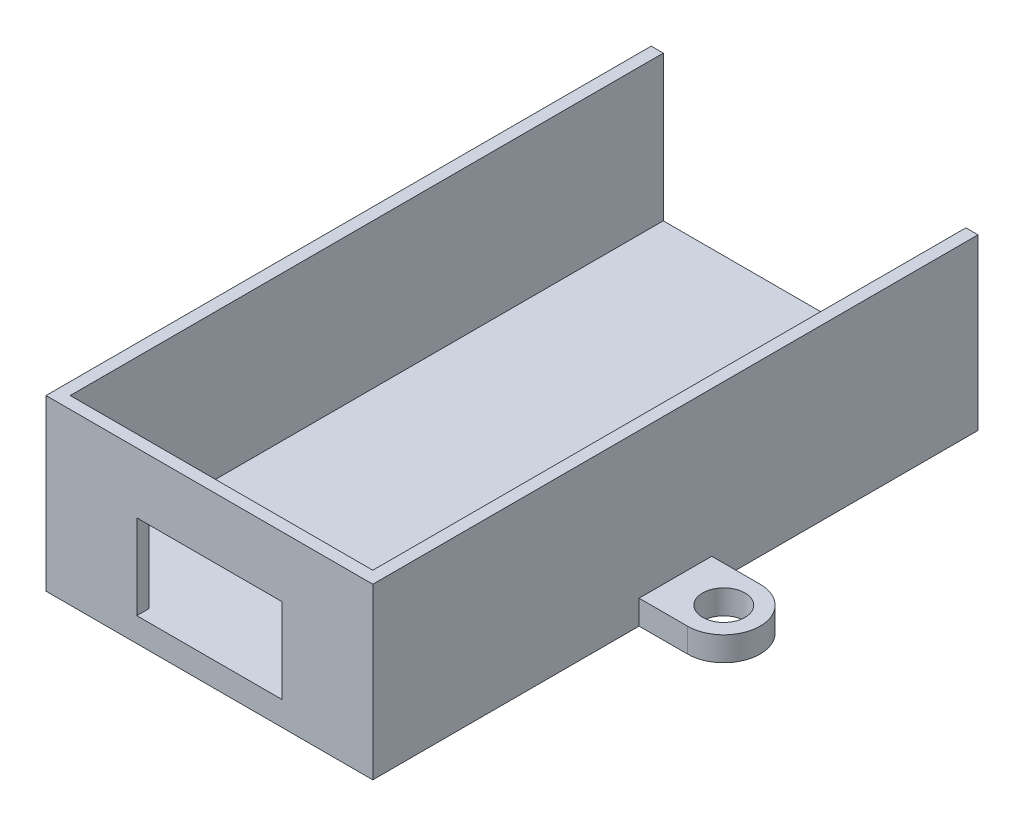
ISO-10303-21;
HEADER;
FILE_DESCRIPTION(('STEP AP214'),'2;1');
FILE_NAME('part.step','',(''),(''),'','','');
FILE_SCHEMA(('AUTOMOTIVE_DESIGN { 1 0 10303 214 1 1 1 1 }'));
ENDSEC;
DATA;
#1=APPLICATION_CONTEXT('core data for automotive mechanical design processes');
#2=APPLICATION_PROTOCOL_DEFINITION('international standard','automotive_design',2000,#1);
#3=PRODUCT_CONTEXT('',#1,'mechanical');
#4=PRODUCT('Part','Part','',(#3));
#5=PRODUCT_RELATED_PRODUCT_CATEGORY('part','',(#4));
#6=PRODUCT_DEFINITION_FORMATION('','',#4);
#7=PRODUCT_DEFINITION_CONTEXT('part definition',#1,'design');
#8=PRODUCT_DEFINITION('design','',#6,#7);
#9=PRODUCT_DEFINITION_SHAPE('','',#8);
#10=(LENGTH_UNIT() NAMED_UNIT(*) SI_UNIT(.MILLI.,.METRE.));
#11=(NAMED_UNIT(*) PLANE_ANGLE_UNIT() SI_UNIT($,.RADIAN.));
#12=(NAMED_UNIT(*) SI_UNIT($,.STERADIAN.) SOLID_ANGLE_UNIT());
#13=UNCERTAINTY_MEASURE_WITH_UNIT(LENGTH_MEASURE(1.E-05),#10,'distance_accuracy_value','');
#14=(GEOMETRIC_REPRESENTATION_CONTEXT(3) GLOBAL_UNCERTAINTY_ASSIGNED_CONTEXT((#13)) GLOBAL_UNIT_ASSIGNED_CONTEXT((#10,
#11,#12)) REPRESENTATION_CONTEXT('',''));
#15=CARTESIAN_POINT('',(0.,0.,0.));
#16=DIRECTION('',(0.,0.,1.));
#17=DIRECTION('',(1.,0.,0.));
#18=AXIS2_PLACEMENT_3D('',#15,#16,#17);
#19=CARTESIAN_POINT('',(0.,2.,0.));
#20=DIRECTION('',(0.,1.,0.));
#21=DIRECTION('',(0.,0.,1.));
#22=AXIS2_PLACEMENT_3D('',#19,#20,#21);
#23=PLANE('',#22);
#24=DIRECTION('',(0.,0.,-1.));
#25=VECTOR('',#24,1.);
#26=CARTESIAN_POINT('',(13.5,2.,25.));
#27=LINE('',#26,#25);
#28=CARTESIAN_POINT('',(13.5,2.,3.));
#29=VERTEX_POINT('',#28);
#30=CARTESIAN_POINT('',(13.5,2.,-3.));
#31=VERTEX_POINT('',#30);
#32=EDGE_CURVE('E249',#29,#31,#27,.T.);
#33=ORIENTED_EDGE('',*,*,#32,.F.);
#34=DIRECTION('',(-1.,0.,0.));
#35=VECTOR('',#34,1.);
#36=CARTESIAN_POINT('',(0.,2.,3.));
#37=LINE('',#36,#35);
#38=CARTESIAN_POINT('',(17.5,2.,3.));
#39=VERTEX_POINT('',#38);
#40=EDGE_CURVE('E283',#39,#29,#37,.T.);
#41=ORIENTED_EDGE('',*,*,#40,.F.);
#42=CARTESIAN_POINT('',(17.5,2.,0.));
#43=DIRECTION('',(0.,1.,0.));
#44=DIRECTION('',(0.,0.,1.));
#45=AXIS2_PLACEMENT_3D('',#42,#43,#44);
#46=CIRCLE('',#45,3.);
#47=CARTESIAN_POINT('',(17.5,2.,-3.));
#48=VERTEX_POINT('',#47);
#49=EDGE_CURVE('E286',#39,#48,#46,.T.);
#50=ORIENTED_EDGE('',*,*,#49,.T.);
#51=DIRECTION('',(-1.,0.,0.));
#52=VECTOR('',#51,1.);
#53=CARTESIAN_POINT('',(0.,2.,-3.));
#54=LINE('',#53,#52);
#55=EDGE_CURVE('E291',#48,#31,#54,.T.);
#56=ORIENTED_EDGE('',*,*,#55,.T.);
#57=EDGE_LOOP('',(#33,#41,#50,#56));
#58=FACE_BOUND('',#57,.T.);
#59=CARTESIAN_POINT('',(17.5,2.,0.));
#60=DIRECTION('',(0.,1.,0.));
#61=DIRECTION('',(0.,0.,1.));
#62=AXIS2_PLACEMENT_3D('',#59,#60,#61);
#63=CIRCLE('',#62,1.75);
#64=CARTESIAN_POINT('',(17.5,2.,1.75));
#65=VERTEX_POINT('',#64);
#66=EDGE_CURVE('E309',#65,#65,#63,.T.);
#67=ORIENTED_EDGE('',*,*,#66,.F.);
#68=EDGE_LOOP('',(#67));
#69=FACE_BOUND('',#68,.T.);
#70=ADVANCED_FACE('F50',(#58,#69),#23,.T.);
#71=DIRECTION('',(0.,0.,1.));
#72=VECTOR('',#71,1.);
#73=CARTESIAN_POINT('',(-13.5,2.,-25.));
#74=LINE('',#73,#72);
#75=CARTESIAN_POINT('',(-13.5,2.,-3.));
#76=VERTEX_POINT('',#75);
#77=CARTESIAN_POINT('',(-13.5,2.,3.));
#78=VERTEX_POINT('',#77);
#79=EDGE_CURVE('E251',#76,#78,#74,.T.);
#80=ORIENTED_EDGE('',*,*,#79,.F.);
#81=DIRECTION('',(1.,0.,0.));
#82=VECTOR('',#81,1.);
#83=CARTESIAN_POINT('',(0.,2.,-3.));
#84=LINE('',#83,#82);
#85=CARTESIAN_POINT('',(-17.5,2.,-3.));
#86=VERTEX_POINT('',#85);
#87=EDGE_CURVE('E296',#86,#76,#84,.T.);
#88=ORIENTED_EDGE('',*,*,#87,.F.);
#89=CARTESIAN_POINT('',(-17.5,2.,0.));
#90=DIRECTION('',(0.,1.,0.));
#91=DIRECTION('',(0.,0.,1.));
#92=AXIS2_PLACEMENT_3D('',#89,#90,#91);
#93=CIRCLE('',#92,3.);
#94=CARTESIAN_POINT('',(-17.5,2.,3.));
#95=VERTEX_POINT('',#94);
#96=EDGE_CURVE('E304',#95,#86,#93,.F.);
#97=ORIENTED_EDGE('',*,*,#96,.F.);
#98=DIRECTION('',(1.,0.,0.));
#99=VECTOR('',#98,1.);
#100=CARTESIAN_POINT('',(0.,2.,3.));
#101=LINE('',#100,#99);
#102=EDGE_CURVE('E307',#95,#78,#101,.T.);
#103=ORIENTED_EDGE('',*,*,#102,.T.);
#104=EDGE_LOOP('',(#80,#88,#97,#103));
#105=FACE_BOUND('',#104,.T.);
#106=CARTESIAN_POINT('',(-17.5,2.,0.));
#107=DIRECTION('',(0.,1.,0.));
#108=DIRECTION('',(0.,0.,1.));
#109=AXIS2_PLACEMENT_3D('',#106,#107,#108);
#110=CIRCLE('',#109,1.75);
#111=CARTESIAN_POINT('',(-17.5,2.,1.75));
#112=VERTEX_POINT('',#111);
#113=EDGE_CURVE('E314',#112,#112,#110,.F.);
#114=ORIENTED_EDGE('',*,*,#113,.T.);
#115=EDGE_LOOP('',(#114));
#116=FACE_BOUND('',#115,.T.);
#117=ADVANCED_FACE('F479',(#105,#116),#23,.T.);
#118=CARTESIAN_POINT('',(0.,2.,25.));
#119=DIRECTION('',(0.,0.,-1.));
#120=DIRECTION('',(-1.,0.,0.));
#121=AXIS2_PLACEMENT_3D('',#118,#119,#120);
#122=PLANE('',#121);
#123=DIRECTION('',(-1.,0.,0.));
#124=VECTOR('',#123,1.);
#125=CARTESIAN_POINT('',(-6.,9.,25.));
#126=LINE('',#125,#124);
#127=CARTESIAN_POINT('',(6.,9.,25.));
#128=VERTEX_POINT('',#127);
#129=CARTESIAN_POINT('',(-6.,9.,25.));
#130=VERTEX_POINT('',#129);
#131=EDGE_CURVE('E198',#128,#130,#126,.T.);
#132=ORIENTED_EDGE('',*,*,#131,.F.);
#133=DIRECTION('',(0.,1.,0.));
#134=VECTOR('',#133,1.);
#135=CARTESIAN_POINT('',(6.,9.,25.));
#136=LINE('',#135,#134);
#137=CARTESIAN_POINT('',(6.,2.,25.));
#138=VERTEX_POINT('',#137);
#139=EDGE_CURVE('E64',#138,#128,#136,.T.);
#140=ORIENTED_EDGE('',*,*,#139,.F.);
#141=DIRECTION('',(1.,0.,0.));
#142=VECTOR('',#141,1.);
#143=CARTESIAN_POINT('',(6.,2.,25.));
#144=LINE('',#143,#142);
#145=CARTESIAN_POINT('',(-5.99999999999999,2.,25.));
#146=VERTEX_POINT('',#145);
#147=EDGE_CURVE('E201',#146,#138,#144,.T.);
#148=ORIENTED_EDGE('',*,*,#147,.F.);
#149=DIRECTION('',(0.,-1.,0.));
#150=VECTOR('',#149,1.);
#151=CARTESIAN_POINT('',(-6.,9.,25.));
#152=LINE('',#151,#150);
#153=EDGE_CURVE('E190',#130,#146,#152,.T.);
#154=ORIENTED_EDGE('',*,*,#153,.F.);
#155=EDGE_LOOP('',(#132,#140,#148,#154));
#156=FACE_BOUND('',#155,.T.);
#157=DIRECTION('',(1.,0.,0.));
#158=VECTOR('',#157,1.);
#159=CARTESIAN_POINT('',(0.,0.,25.));
#160=LINE('',#159,#158);
#161=CARTESIAN_POINT('',(-13.5,0.,25.));
#162=VERTEX_POINT('',#161);
#163=CARTESIAN_POINT('',(13.5,0.,25.));
#164=VERTEX_POINT('',#163);
#165=EDGE_CURVE('E325',#162,#164,#160,.T.);
#166=ORIENTED_EDGE('',*,*,#165,.T.);
#167=DIRECTION('',(0.,-1.,0.));
#168=VECTOR('',#167,1.);
#169=CARTESIAN_POINT('',(13.5,2.,25.));
#170=LINE('',#169,#168);
#171=CARTESIAN_POINT('',(13.5,14.,25.));
#172=VERTEX_POINT('',#171);
#173=EDGE_CURVE('E393',#172,#164,#170,.T.);
#174=ORIENTED_EDGE('',*,*,#173,.F.);
#175=DIRECTION('',(1.,0.,0.));
#176=VECTOR('',#175,1.);
#177=CARTESIAN_POINT('',(-13.5,14.,25.));
#178=LINE('',#177,#176);
#179=CARTESIAN_POINT('',(-13.5,14.,25.));
#180=VERTEX_POINT('',#179);
#181=EDGE_CURVE('E244',#180,#172,#178,.T.);
#182=ORIENTED_EDGE('',*,*,#181,.F.);
#183=DIRECTION('',(0.,-1.,0.));
#184=VECTOR('',#183,1.);
#185=CARTESIAN_POINT('',(-13.5,2.,25.));
#186=LINE('',#185,#184);
#187=EDGE_CURVE('E268',#180,#162,#186,.T.);
#188=ORIENTED_EDGE('',*,*,#187,.T.);
#189=EDGE_LOOP('',(#166,#174,#182,#188));
#190=FACE_BOUND('',#189,.T.);
#191=ADVANCED_FACE('F47',(#156,#190),#122,.F.);
#192=CARTESIAN_POINT('',(0.,2.,3.));
#193=DIRECTION('',(0.,0.,1.));
#194=DIRECTION('',(1.,0.,0.));
#195=AXIS2_PLACEMENT_3D('',#192,#193,#194);
#196=PLANE('',#195);
#197=DIRECTION('',(-1.,0.,0.));
#198=VECTOR('',#197,1.);
#199=CARTESIAN_POINT('',(0.,0.,3.));
#200=LINE('',#199,#198);
#201=CARTESIAN_POINT('',(17.5,0.,3.));
#202=VERTEX_POINT('',#201);
#203=CARTESIAN_POINT('',(13.5,0.,3.));
#204=VERTEX_POINT('',#203);
#205=EDGE_CURVE('E329',#202,#204,#200,.T.);
#206=ORIENTED_EDGE('',*,*,#205,.F.);
#207=DIRECTION('',(0.,-1.,0.));
#208=VECTOR('',#207,1.);
#209=CARTESIAN_POINT('',(17.5,2.,3.));
#210=LINE('',#209,#208);
#211=EDGE_CURVE('E386',#39,#202,#210,.T.);
#212=ORIENTED_EDGE('',*,*,#211,.F.);
#213=ORIENTED_EDGE('',*,*,#40,.T.);
#214=DIRECTION('',(0.,-1.,0.));
#215=VECTOR('',#214,1.);
#216=CARTESIAN_POINT('',(13.5,2.,3.));
#217=LINE('',#216,#215);
#218=EDGE_CURVE('E395',#29,#204,#217,.T.);
#219=ORIENTED_EDGE('',*,*,#218,.T.);
#220=EDGE_LOOP('',(#206,#212,#213,#219));
#221=FACE_BOUND('',#220,.T.);
#222=ADVANCED_FACE('F450',(#221),#196,.T.);
#223=CARTESIAN_POINT('',(17.5,2.,0.));
#224=DIRECTION('',(0.,-1.,0.));
#225=DIRECTION('',(0.,0.,-1.));
#226=AXIS2_PLACEMENT_3D('',#223,#224,#225);
#227=CYLINDRICAL_SURFACE('',#226,3.);
#228=CARTESIAN_POINT('',(17.5,0.,0.));
#229=DIRECTION('',(0.,1.,0.));
#230=DIRECTION('',(0.,0.,1.));
#231=AXIS2_PLACEMENT_3D('',#228,#229,#230);
#232=CIRCLE('',#231,3.);
#233=CARTESIAN_POINT('',(17.5,0.,-3.));
#234=VERTEX_POINT('',#233);
#235=EDGE_CURVE('E333',#202,#234,#232,.T.);
#236=ORIENTED_EDGE('',*,*,#235,.T.);
#237=DIRECTION('',(0.,-1.,0.));
#238=VECTOR('',#237,1.);
#239=CARTESIAN_POINT('',(17.5,2.,-3.));
#240=LINE('',#239,#238);
#241=EDGE_CURVE('E384',#48,#234,#240,.T.);
#242=ORIENTED_EDGE('',*,*,#241,.F.);
#243=ORIENTED_EDGE('',*,*,#49,.F.);
#244=ORIENTED_EDGE('',*,*,#211,.T.);
#245=EDGE_LOOP('',(#236,#242,#243,#244));
#246=FACE_BOUND('',#245,.T.);
#247=ADVANCED_FACE('F441',(#246),#227,.T.);
#248=CARTESIAN_POINT('',(0.,2.,-3.));
#249=DIRECTION('',(0.,0.,1.));
#250=DIRECTION('',(1.,0.,0.));
#251=AXIS2_PLACEMENT_3D('',#248,#249,#250);
#252=PLANE('',#251);
#253=DIRECTION('',(-1.,0.,0.));
#254=VECTOR('',#253,1.);
#255=CARTESIAN_POINT('',(0.,0.,-3.));
#256=LINE('',#255,#254);
#257=CARTESIAN_POINT('',(13.5,0.,-3.));
#258=VERTEX_POINT('',#257);
#259=EDGE_CURVE('E339',#234,#258,#256,.T.);
#260=ORIENTED_EDGE('',*,*,#259,.T.);
#261=DIRECTION('',(0.,-1.,0.));
#262=VECTOR('',#261,1.);
#263=CARTESIAN_POINT('',(13.5,2.,-3.));
#264=LINE('',#263,#262);
#265=EDGE_CURVE('E381',#31,#258,#264,.T.);
#266=ORIENTED_EDGE('',*,*,#265,.F.);
#267=ORIENTED_EDGE('',*,*,#55,.F.);
#268=ORIENTED_EDGE('',*,*,#241,.T.);
#269=EDGE_LOOP('',(#260,#266,#267,#268));
#270=FACE_BOUND('',#269,.T.);
#271=ADVANCED_FACE('F438',(#270),#252,.F.);
#272=CARTESIAN_POINT('',(13.5,2.,0.));
#273=DIRECTION('',(-1.,0.,0.));
#274=DIRECTION('',(0.,0.,1.));
#275=AXIS2_PLACEMENT_3D('',#272,#273,#274);
#276=PLANE('',#275);
#277=DIRECTION('',(0.,0.,-1.));
#278=VECTOR('',#277,1.);
#279=CARTESIAN_POINT('',(13.5,0.,0.));
#280=LINE('',#279,#278);
#281=CARTESIAN_POINT('',(13.5,0.,-25.));
#282=VERTEX_POINT('',#281);
#283=EDGE_CURVE('E332',#258,#282,#280,.T.);
#284=ORIENTED_EDGE('',*,*,#283,.T.);
#285=DIRECTION('',(0.,-1.,0.));
#286=VECTOR('',#285,1.);
#287=CARTESIAN_POINT('',(13.5,2.,-25.));
#288=LINE('',#287,#286);
#289=CARTESIAN_POINT('',(13.5,14.,-25.));
#290=VERTEX_POINT('',#289);
#291=EDGE_CURVE('E378',#290,#282,#288,.T.);
#292=ORIENTED_EDGE('',*,*,#291,.F.);
#293=DIRECTION('',(0.,0.,-1.));
#294=VECTOR('',#293,1.);
#295=CARTESIAN_POINT('',(13.5,14.,25.));
#296=LINE('',#295,#294);
#297=EDGE_CURVE('E217',#172,#290,#296,.T.);
#298=ORIENTED_EDGE('',*,*,#297,.F.);
#299=ORIENTED_EDGE('',*,*,#173,.T.);
#300=EDGE_CURVE('E326',#164,#204,#280,.T.);
#301=ORIENTED_EDGE('',*,*,#300,.T.);
#302=ORIENTED_EDGE('',*,*,#218,.F.);
#303=ORIENTED_EDGE('',*,*,#32,.T.);
#304=ORIENTED_EDGE('',*,*,#265,.T.);
#305=EDGE_LOOP('',(#284,#292,#298,#299,#301,#302,#303,#304));
#306=FACE_BOUND('',#305,.T.);
#307=ADVANCED_FACE('F433',(#306),#276,.F.);
#308=CARTESIAN_POINT('',(0.,2.,-25.));
#309=DIRECTION('',(0.,0.,-1.));
#310=DIRECTION('',(-1.,0.,0.));
#311=AXIS2_PLACEMENT_3D('',#308,#309,#310);
#312=PLANE('',#311);
#313=DIRECTION('',(1.,0.,0.));
#314=VECTOR('',#313,1.);
#315=CARTESIAN_POINT('',(0.,0.,-25.));
#316=LINE('',#315,#314);
#317=CARTESIAN_POINT('',(-13.5,0.,-25.));
#318=VERTEX_POINT('',#317);
#319=EDGE_CURVE('E342',#318,#282,#316,.T.);
#320=ORIENTED_EDGE('',*,*,#319,.F.);
#321=DIRECTION('',(0.,-1.,0.));
#322=VECTOR('',#321,1.);
#323=CARTESIAN_POINT('',(-13.5,2.,-25.));
#324=LINE('',#323,#322);
#325=CARTESIAN_POINT('',(-13.5,14.,-25.));
#326=VERTEX_POINT('',#325);
#327=EDGE_CURVE('E374',#326,#318,#324,.T.);
#328=ORIENTED_EDGE('',*,*,#327,.F.);
#329=DIRECTION('',(-1.,0.,0.));
#330=VECTOR('',#329,1.);
#331=CARTESIAN_POINT('',(-13.5,14.,-25.));
#332=LINE('',#331,#330);
#333=CARTESIAN_POINT('',(-12.5,14.,-25.));
#334=VERTEX_POINT('',#333);
#335=EDGE_CURVE('E233',#334,#326,#332,.T.);
#336=ORIENTED_EDGE('',*,*,#335,.F.);
#337=DIRECTION('',(0.,-1.,0.));
#338=VECTOR('',#337,1.);
#339=CARTESIAN_POINT('',(-12.5,14.,-25.));
#340=LINE('',#339,#338);
#341=CARTESIAN_POINT('',(-12.5,2.,-25.));
#342=VERTEX_POINT('',#341);
#343=EDGE_CURVE('E250',#334,#342,#340,.T.);
#344=ORIENTED_EDGE('',*,*,#343,.T.);
#345=DIRECTION('',(1.,0.,0.));
#346=VECTOR('',#345,1.);
#347=CARTESIAN_POINT('',(0.,2.,-25.));
#348=LINE('',#347,#346);
#349=CARTESIAN_POINT('',(12.5,2.,-25.));
#350=VERTEX_POINT('',#349);
#351=EDGE_CURVE('E297',#342,#350,#348,.T.);
#352=ORIENTED_EDGE('',*,*,#351,.T.);
#353=DIRECTION('',(0.,-1.,0.));
#354=VECTOR('',#353,1.);
#355=CARTESIAN_POINT('',(12.5,14.,-25.));
#356=LINE('',#355,#354);
#357=CARTESIAN_POINT('',(12.5,14.,-25.));
#358=VERTEX_POINT('',#357);
#359=EDGE_CURVE('E278',#358,#350,#356,.T.);
#360=ORIENTED_EDGE('',*,*,#359,.F.);
#361=DIRECTION('',(-1.,0.,0.));
#362=VECTOR('',#361,1.);
#363=CARTESIAN_POINT('',(12.5,14.,-25.));
#364=LINE('',#363,#362);
#365=EDGE_CURVE('E225',#290,#358,#364,.T.);
#366=ORIENTED_EDGE('',*,*,#365,.F.);
#367=ORIENTED_EDGE('',*,*,#291,.T.);
#368=EDGE_LOOP('',(#320,#328,#336,#344,#352,#360,#366,#367));
#369=FACE_BOUND('',#368,.T.);
#370=ADVANCED_FACE('F428',(#369),#312,.T.);
#371=CARTESIAN_POINT('',(-13.5,2.,0.));
#372=DIRECTION('',(-1.,0.,0.));
#373=DIRECTION('',(0.,0.,1.));
#374=AXIS2_PLACEMENT_3D('',#371,#372,#373);
#375=PLANE('',#374);
#376=DIRECTION('',(0.,0.,-1.));
#377=VECTOR('',#376,1.);
#378=CARTESIAN_POINT('',(-13.5,0.,0.));
#379=LINE('',#378,#377);
#380=CARTESIAN_POINT('',(-13.5,0.,-3.));
#381=VERTEX_POINT('',#380);
#382=EDGE_CURVE('E323',#381,#318,#379,.T.);
#383=ORIENTED_EDGE('',*,*,#382,.F.);
#384=DIRECTION('',(0.,-1.,0.));
#385=VECTOR('',#384,1.);
#386=CARTESIAN_POINT('',(-13.5,2.,-3.));
#387=LINE('',#386,#385);
#388=EDGE_CURVE('E375',#76,#381,#387,.T.);
#389=ORIENTED_EDGE('',*,*,#388,.F.);
#390=ORIENTED_EDGE('',*,*,#79,.T.);
#391=DIRECTION('',(0.,-1.,0.));
#392=VECTOR('',#391,1.);
#393=CARTESIAN_POINT('',(-13.5,2.,3.));
#394=LINE('',#393,#392);
#395=CARTESIAN_POINT('',(-13.5,0.,3.));
#396=VERTEX_POINT('',#395);
#397=EDGE_CURVE('E318',#78,#396,#394,.T.);
#398=ORIENTED_EDGE('',*,*,#397,.T.);
#399=EDGE_CURVE('E281',#162,#396,#379,.T.);
#400=ORIENTED_EDGE('',*,*,#399,.F.);
#401=ORIENTED_EDGE('',*,*,#187,.F.);
#402=DIRECTION('',(0.,0.,1.));
#403=VECTOR('',#402,1.);
#404=CARTESIAN_POINT('',(-13.5,14.,-25.));
#405=LINE('',#404,#403);
#406=EDGE_CURVE('E239',#326,#180,#405,.T.);
#407=ORIENTED_EDGE('',*,*,#406,.F.);
#408=ORIENTED_EDGE('',*,*,#327,.T.);
#409=EDGE_LOOP('',(#383,#389,#390,#398,#400,#401,#407,#408));
#410=FACE_BOUND('',#409,.T.);
#411=ADVANCED_FACE('F424',(#410),#375,.T.);
#412=CARTESIAN_POINT('',(0.,2.,-3.));
#413=DIRECTION('',(0.,0.,-1.));
#414=DIRECTION('',(-1.,0.,0.));
#415=AXIS2_PLACEMENT_3D('',#412,#413,#414);
#416=PLANE('',#415);
#417=DIRECTION('',(1.,0.,0.));
#418=VECTOR('',#417,1.);
#419=CARTESIAN_POINT('',(0.,0.,-3.));
#420=LINE('',#419,#418);
#421=CARTESIAN_POINT('',(-17.5,0.,-3.));
#422=VERTEX_POINT('',#421);
#423=EDGE_CURVE('E343',#422,#381,#420,.T.);
#424=ORIENTED_EDGE('',*,*,#423,.F.);
#425=DIRECTION('',(0.,-1.,0.));
#426=VECTOR('',#425,1.);
#427=CARTESIAN_POINT('',(-17.5,2.,-3.));
#428=LINE('',#427,#426);
#429=EDGE_CURVE('E369',#86,#422,#428,.T.);
#430=ORIENTED_EDGE('',*,*,#429,.F.);
#431=ORIENTED_EDGE('',*,*,#87,.T.);
#432=ORIENTED_EDGE('',*,*,#388,.T.);
#433=EDGE_LOOP('',(#424,#430,#431,#432));
#434=FACE_BOUND('',#433,.T.);
#435=ADVANCED_FACE('F514',(#434),#416,.T.);
#436=CARTESIAN_POINT('',(-17.5,2.,0.));
#437=DIRECTION('',(0.,-1.,0.));
#438=DIRECTION('',(0.,0.,-1.));
#439=AXIS2_PLACEMENT_3D('',#436,#437,#438);
#440=CYLINDRICAL_SURFACE('',#439,3.);
#441=CARTESIAN_POINT('',(-17.5,0.,0.));
#442=DIRECTION('',(0.,1.,0.));
#443=DIRECTION('',(0.,0.,1.));
#444=AXIS2_PLACEMENT_3D('',#441,#442,#443);
#445=CIRCLE('',#444,3.);
#446=CARTESIAN_POINT('',(-17.5,0.,3.));
#447=VERTEX_POINT('',#446);
#448=EDGE_CURVE('E349',#447,#422,#445,.F.);
#449=ORIENTED_EDGE('',*,*,#448,.F.);
#450=DIRECTION('',(0.,-1.,0.));
#451=VECTOR('',#450,1.);
#452=CARTESIAN_POINT('',(-17.5,2.,3.));
#453=LINE('',#452,#451);
#454=EDGE_CURVE('E368',#95,#447,#453,.T.);
#455=ORIENTED_EDGE('',*,*,#454,.F.);
#456=ORIENTED_EDGE('',*,*,#96,.T.);
#457=ORIENTED_EDGE('',*,*,#429,.T.);
#458=EDGE_LOOP('',(#449,#455,#456,#457));
#459=FACE_BOUND('',#458,.T.);
#460=ADVANCED_FACE('F506',(#459),#440,.T.);
#461=CARTESIAN_POINT('',(17.5,2.,0.));
#462=DIRECTION('',(0.,-1.,0.));
#463=DIRECTION('',(0.,0.,-1.));
#464=AXIS2_PLACEMENT_3D('',#461,#462,#463);
#465=CYLINDRICAL_SURFACE('',#464,1.75);
#466=ORIENTED_EDGE('',*,*,#66,.T.);
#467=EDGE_LOOP('',(#466));
#468=FACE_BOUND('',#467,.T.);
#469=CARTESIAN_POINT('',(17.5,0.,0.));
#470=DIRECTION('',(0.,1.,0.));
#471=DIRECTION('',(0.,0.,1.));
#472=AXIS2_PLACEMENT_3D('',#469,#470,#471);
#473=CIRCLE('',#472,1.75);
#474=CARTESIAN_POINT('',(17.5,0.,1.75));
#475=VERTEX_POINT('',#474);
#476=EDGE_CURVE('E360',#475,#475,#473,.T.);
#477=ORIENTED_EDGE('',*,*,#476,.F.);
#478=EDGE_LOOP('',(#477));
#479=FACE_BOUND('',#478,.T.);
#480=ADVANCED_FACE('F504',(#468,#479),#465,.F.);
#481=CARTESIAN_POINT('',(0.,2.,3.));
#482=DIRECTION('',(0.,0.,-1.));
#483=DIRECTION('',(-1.,0.,0.));
#484=AXIS2_PLACEMENT_3D('',#481,#482,#483);
#485=PLANE('',#484);
#486=DIRECTION('',(1.,0.,0.));
#487=VECTOR('',#486,1.);
#488=CARTESIAN_POINT('',(0.,0.,3.));
#489=LINE('',#488,#487);
#490=EDGE_CURVE('E354',#447,#396,#489,.T.);
#491=ORIENTED_EDGE('',*,*,#490,.T.);
#492=ORIENTED_EDGE('',*,*,#397,.F.);
#493=ORIENTED_EDGE('',*,*,#102,.F.);
#494=ORIENTED_EDGE('',*,*,#454,.T.);
#495=EDGE_LOOP('',(#491,#492,#493,#494));
#496=FACE_BOUND('',#495,.T.);
#497=ADVANCED_FACE('F497',(#496),#485,.F.);
#498=CARTESIAN_POINT('',(-17.5,2.,0.));
#499=DIRECTION('',(0.,-1.,0.));
#500=DIRECTION('',(0.,0.,-1.));
#501=AXIS2_PLACEMENT_3D('',#498,#499,#500);
#502=CYLINDRICAL_SURFACE('',#501,1.75);
#503=ORIENTED_EDGE('',*,*,#113,.F.);
#504=EDGE_LOOP('',(#503));
#505=FACE_BOUND('',#504,.T.);
#506=CARTESIAN_POINT('',(-17.5,0.,0.));
#507=DIRECTION('',(0.,1.,0.));
#508=DIRECTION('',(0.,0.,1.));
#509=AXIS2_PLACEMENT_3D('',#506,#507,#508);
#510=CIRCLE('',#509,1.75);
#511=CARTESIAN_POINT('',(-17.5,0.,1.75));
#512=VERTEX_POINT('',#511);
#513=EDGE_CURVE('E288',#512,#512,#510,.F.);
#514=ORIENTED_EDGE('',*,*,#513,.T.);
#515=EDGE_LOOP('',(#514));
#516=FACE_BOUND('',#515,.T.);
#517=ADVANCED_FACE('F491',(#505,#516),#502,.F.);
#518=DIRECTION('',(-1.,0.,0.));
#519=VECTOR('',#518,1.);
#520=CARTESIAN_POINT('',(-12.5,2.,24.));
#521=LINE('',#520,#519);
#522=CARTESIAN_POINT('',(-5.99999999999999,2.,24.));
#523=VERTEX_POINT('',#522);
#524=CARTESIAN_POINT('',(-12.5,2.,24.));
#525=VERTEX_POINT('',#524);
#526=EDGE_CURVE('E260',#523,#525,#521,.T.);
#527=ORIENTED_EDGE('',*,*,#526,.F.);
#528=DIRECTION('',(0.,0.,1.));
#529=VECTOR('',#528,1.);
#530=CARTESIAN_POINT('',(-5.99999999999999,2.,-25.));
#531=LINE('',#530,#529);
#532=EDGE_CURVE('E195',#523,#146,#531,.T.);
#533=ORIENTED_EDGE('',*,*,#532,.T.);
#534=ORIENTED_EDGE('',*,*,#147,.T.);
#535=DIRECTION('',(0.,0.,1.));
#536=VECTOR('',#535,1.);
#537=CARTESIAN_POINT('',(6.,2.,-25.));
#538=LINE('',#537,#536);
#539=CARTESIAN_POINT('',(6.,2.,24.));
#540=VERTEX_POINT('',#539);
#541=EDGE_CURVE('E209',#540,#138,#538,.T.);
#542=ORIENTED_EDGE('',*,*,#541,.F.);
#543=CARTESIAN_POINT('',(12.5,2.,24.));
#544=VERTEX_POINT('',#543);
#545=EDGE_CURVE('E256',#544,#540,#521,.T.);
#546=ORIENTED_EDGE('',*,*,#545,.F.);
#547=DIRECTION('',(0.,0.,1.));
#548=VECTOR('',#547,1.);
#549=CARTESIAN_POINT('',(12.5,2.,24.));
#550=LINE('',#549,#548);
#551=EDGE_CURVE('E213',#350,#544,#550,.T.);
#552=ORIENTED_EDGE('',*,*,#551,.F.);
#553=ORIENTED_EDGE('',*,*,#351,.F.);
#554=DIRECTION('',(0.,0.,-1.));
#555=VECTOR('',#554,1.);
#556=CARTESIAN_POINT('',(-12.5,2.,-25.));
#557=LINE('',#556,#555);
#558=EDGE_CURVE('E224',#525,#342,#557,.T.);
#559=ORIENTED_EDGE('',*,*,#558,.F.);
#560=EDGE_LOOP('',(#527,#533,#534,#542,#546,#552,#553,#559));
#561=FACE_BOUND('',#560,.T.);
#562=ADVANCED_FACE('F406',(#561),#23,.T.);
#563=CARTESIAN_POINT('',(0.,0.,0.));
#564=DIRECTION('',(0.,1.,0.));
#565=DIRECTION('',(0.,0.,1.));
#566=AXIS2_PLACEMENT_3D('',#563,#564,#565);
#567=PLANE('',#566);
#568=ORIENTED_EDGE('',*,*,#399,.T.);
#569=ORIENTED_EDGE('',*,*,#490,.F.);
#570=ORIENTED_EDGE('',*,*,#448,.T.);
#571=ORIENTED_EDGE('',*,*,#423,.T.);
#572=ORIENTED_EDGE('',*,*,#382,.T.);
#573=ORIENTED_EDGE('',*,*,#319,.T.);
#574=ORIENTED_EDGE('',*,*,#283,.F.);
#575=ORIENTED_EDGE('',*,*,#259,.F.);
#576=ORIENTED_EDGE('',*,*,#235,.F.);
#577=ORIENTED_EDGE('',*,*,#205,.T.);
#578=ORIENTED_EDGE('',*,*,#300,.F.);
#579=ORIENTED_EDGE('',*,*,#165,.F.);
#580=EDGE_LOOP('',(#568,#569,#570,#571,#572,#573,#574,#575,#576,#577,#578,#579));
#581=FACE_BOUND('',#580,.T.);
#582=ORIENTED_EDGE('',*,*,#476,.T.);
#583=EDGE_LOOP('',(#582));
#584=FACE_BOUND('',#583,.T.);
#585=ORIENTED_EDGE('',*,*,#513,.F.);
#586=EDGE_LOOP('',(#585));
#587=FACE_BOUND('',#586,.T.);
#588=ADVANCED_FACE('F417',(#581,#584,#587),#567,.F.);
#589=CARTESIAN_POINT('',(12.5,14.,24.));
#590=DIRECTION('',(1.,0.,0.));
#591=DIRECTION('',(0.,0.,-1.));
#592=AXIS2_PLACEMENT_3D('',#589,#590,#591);
#593=PLANE('',#592);
#594=ORIENTED_EDGE('',*,*,#551,.T.);
#595=DIRECTION('',(0.,-1.,0.));
#596=VECTOR('',#595,1.);
#597=CARTESIAN_POINT('',(12.5,14.,24.));
#598=LINE('',#597,#596);
#599=CARTESIAN_POINT('',(12.5,14.,24.));
#600=VERTEX_POINT('',#599);
#601=EDGE_CURVE('E277',#600,#544,#598,.T.);
#602=ORIENTED_EDGE('',*,*,#601,.F.);
#603=DIRECTION('',(0.,0.,1.));
#604=VECTOR('',#603,1.);
#605=CARTESIAN_POINT('',(12.5,14.,24.));
#606=LINE('',#605,#604);
#607=EDGE_CURVE('E227',#358,#600,#606,.T.);
#608=ORIENTED_EDGE('',*,*,#607,.F.);
#609=ORIENTED_EDGE('',*,*,#359,.T.);
#610=EDGE_LOOP('',(#594,#602,#608,#609));
#611=FACE_BOUND('',#610,.T.);
#612=ADVANCED_FACE('F461',(#611),#593,.F.);
#613=CARTESIAN_POINT('',(-12.5,14.,24.));
#614=DIRECTION('',(0.,0.,1.));
#615=DIRECTION('',(1.,0.,0.));
#616=AXIS2_PLACEMENT_3D('',#613,#614,#615);
#617=PLANE('',#616);
#618=ORIENTED_EDGE('',*,*,#545,.T.);
#619=DIRECTION('',(0.,1.,0.));
#620=VECTOR('',#619,1.);
#621=CARTESIAN_POINT('',(6.,14.,24.));
#622=LINE('',#621,#620);
#623=CARTESIAN_POINT('',(6.,9.,24.));
#624=VERTEX_POINT('',#623);
#625=EDGE_CURVE('E11',#540,#624,#622,.T.);
#626=ORIENTED_EDGE('',*,*,#625,.T.);
#627=DIRECTION('',(-1.,0.,0.));
#628=VECTOR('',#627,1.);
#629=CARTESIAN_POINT('',(-12.5,9.,24.));
#630=LINE('',#629,#628);
#631=CARTESIAN_POINT('',(-6.,9.,24.));
#632=VERTEX_POINT('',#631);
#633=EDGE_CURVE('E252',#624,#632,#630,.T.);
#634=ORIENTED_EDGE('',*,*,#633,.T.);
#635=DIRECTION('',(0.,-1.,0.));
#636=VECTOR('',#635,1.);
#637=CARTESIAN_POINT('',(-6.,14.,24.));
#638=LINE('',#637,#636);
#639=EDGE_CURVE('E57',#632,#523,#638,.T.);
#640=ORIENTED_EDGE('',*,*,#639,.T.);
#641=ORIENTED_EDGE('',*,*,#526,.T.);
#642=DIRECTION('',(0.,-1.,0.));
#643=VECTOR('',#642,1.);
#644=CARTESIAN_POINT('',(-12.5,14.,24.));
#645=LINE('',#644,#643);
#646=CARTESIAN_POINT('',(-12.5,14.,24.));
#647=VERTEX_POINT('',#646);
#648=EDGE_CURVE('E275',#647,#525,#645,.T.);
#649=ORIENTED_EDGE('',*,*,#648,.F.);
#650=DIRECTION('',(-1.,0.,0.));
#651=VECTOR('',#650,1.);
#652=CARTESIAN_POINT('',(-12.5,14.,24.));
#653=LINE('',#652,#651);
#654=EDGE_CURVE('E226',#600,#647,#653,.T.);
#655=ORIENTED_EDGE('',*,*,#654,.F.);
#656=ORIENTED_EDGE('',*,*,#601,.T.);
#657=EDGE_LOOP('',(#618,#626,#634,#640,#641,#649,#655,#656));
#658=FACE_BOUND('',#657,.T.);
#659=ADVANCED_FACE('F403',(#658),#617,.F.);
#660=CARTESIAN_POINT('',(-12.5,14.,-25.));
#661=DIRECTION('',(-1.,0.,0.));
#662=DIRECTION('',(0.,0.,1.));
#663=AXIS2_PLACEMENT_3D('',#660,#661,#662);
#664=PLANE('',#663);
#665=ORIENTED_EDGE('',*,*,#558,.T.);
#666=ORIENTED_EDGE('',*,*,#343,.F.);
#667=DIRECTION('',(0.,0.,-1.));
#668=VECTOR('',#667,1.);
#669=CARTESIAN_POINT('',(-12.5,14.,-25.));
#670=LINE('',#669,#668);
#671=EDGE_CURVE('E235',#647,#334,#670,.T.);
#672=ORIENTED_EDGE('',*,*,#671,.F.);
#673=ORIENTED_EDGE('',*,*,#648,.T.);
#674=EDGE_LOOP('',(#665,#666,#672,#673));
#675=FACE_BOUND('',#674,.T.);
#676=ADVANCED_FACE('F459',(#675),#664,.F.);
#677=CARTESIAN_POINT('',(0.,14.,0.));
#678=DIRECTION('',(0.,-1.,0.));
#679=DIRECTION('',(0.,0.,-1.));
#680=AXIS2_PLACEMENT_3D('',#677,#678,#679);
#681=PLANE('',#680);
#682=ORIENTED_EDGE('',*,*,#297,.T.);
#683=ORIENTED_EDGE('',*,*,#365,.T.);
#684=ORIENTED_EDGE('',*,*,#607,.T.);
#685=ORIENTED_EDGE('',*,*,#654,.T.);
#686=ORIENTED_EDGE('',*,*,#671,.T.);
#687=ORIENTED_EDGE('',*,*,#335,.T.);
#688=ORIENTED_EDGE('',*,*,#406,.T.);
#689=ORIENTED_EDGE('',*,*,#181,.T.);
#690=EDGE_LOOP('',(#682,#683,#684,#685,#686,#687,#688,#689));
#691=FACE_BOUND('',#690,.T.);
#692=ADVANCED_FACE('F451',(#691),#681,.F.);
#693=CARTESIAN_POINT('',(6.,9.,-25.));
#694=DIRECTION('',(1.,0.,0.));
#695=DIRECTION('',(0.,1.,0.));
#696=AXIS2_PLACEMENT_3D('',#693,#694,#695);
#697=PLANE('',#696);
#698=ORIENTED_EDGE('',*,*,#541,.T.);
#699=ORIENTED_EDGE('',*,*,#139,.T.);
#700=DIRECTION('',(0.,0.,1.));
#701=VECTOR('',#700,1.);
#702=CARTESIAN_POINT('',(6.,9.,-25.));
#703=LINE('',#702,#701);
#704=EDGE_CURVE('E194',#624,#128,#703,.T.);
#705=ORIENTED_EDGE('',*,*,#704,.F.);
#706=ORIENTED_EDGE('',*,*,#625,.F.);
#707=EDGE_LOOP('',(#698,#699,#705,#706));
#708=FACE_BOUND('',#707,.T.);
#709=ADVANCED_FACE('F467',(#708),#697,.F.);
#710=CARTESIAN_POINT('',(-6.,9.,-25.));
#711=DIRECTION('',(-1.,0.,0.));
#712=DIRECTION('',(0.,-1.,0.));
#713=AXIS2_PLACEMENT_3D('',#710,#711,#712);
#714=PLANE('',#713);
#715=DIRECTION('',(0.,0.,1.));
#716=VECTOR('',#715,1.);
#717=CARTESIAN_POINT('',(-6.,9.,-25.));
#718=LINE('',#717,#716);
#719=EDGE_CURVE('E72',#632,#130,#718,.T.);
#720=ORIENTED_EDGE('',*,*,#719,.T.);
#721=ORIENTED_EDGE('',*,*,#153,.T.);
#722=ORIENTED_EDGE('',*,*,#532,.F.);
#723=ORIENTED_EDGE('',*,*,#639,.F.);
#724=EDGE_LOOP('',(#720,#721,#722,#723));
#725=FACE_BOUND('',#724,.T.);
#726=ADVANCED_FACE('F183',(#725),#714,.F.);
#727=CARTESIAN_POINT('',(-6.,9.,-25.));
#728=DIRECTION('',(0.,1.,0.));
#729=DIRECTION('',(-1.,0.,0.));
#730=AXIS2_PLACEMENT_3D('',#727,#728,#729);
#731=PLANE('',#730);
#732=ORIENTED_EDGE('',*,*,#704,.T.);
#733=ORIENTED_EDGE('',*,*,#131,.T.);
#734=ORIENTED_EDGE('',*,*,#719,.F.);
#735=ORIENTED_EDGE('',*,*,#633,.F.);
#736=EDGE_LOOP('',(#732,#733,#734,#735));
#737=FACE_BOUND('',#736,.T.);
#738=ADVANCED_FACE('F197',(#737),#731,.F.);
#739=CLOSED_SHELL('',(#70,#117,#191,#222,#247,#271,#307,#370,#411,#435,#460,#480,#497,#517,#562,
#588,#612,#659,#676,#692,#709,#726,#738));
#740=MANIFOLD_SOLID_BREP('B2',#739);
#741=ADVANCED_BREP_SHAPE_REPRESENTATION('',(#18,#740),#14);
#742=SHAPE_DEFINITION_REPRESENTATION(#9,#741);
ENDSEC;
END-ISO-10303-21;
